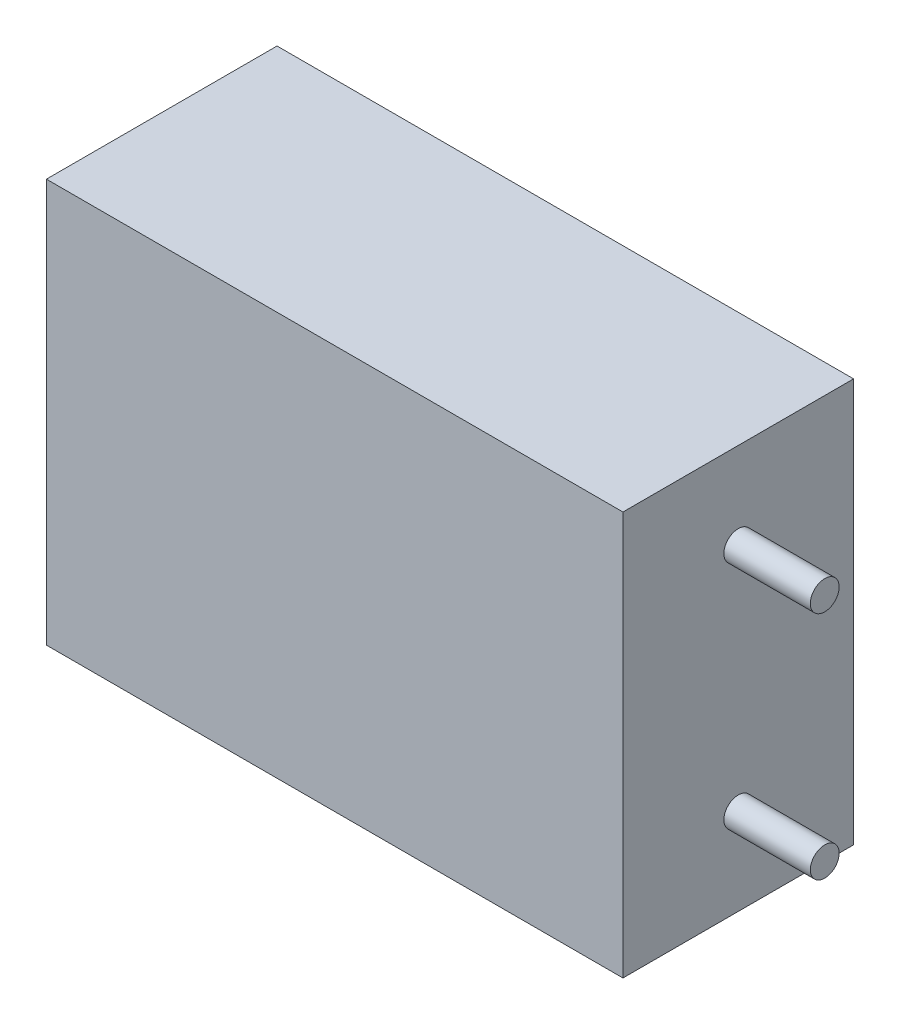
ISO-10303-21;
HEADER;
FILE_DESCRIPTION(('STEP AP214'),'2;1');
FILE_NAME('part.step','',(''),(''),'','','');
FILE_SCHEMA(('AUTOMOTIVE_DESIGN { 1 0 10303 214 1 1 1 1 }'));
ENDSEC;
DATA;
#1=APPLICATION_CONTEXT('core data for automotive mechanical design processes');
#2=APPLICATION_PROTOCOL_DEFINITION('international standard','automotive_design',2000,#1);
#3=PRODUCT_CONTEXT('',#1,'mechanical');
#4=PRODUCT('Part','Part','',(#3));
#5=PRODUCT_RELATED_PRODUCT_CATEGORY('part','',(#4));
#6=PRODUCT_DEFINITION_FORMATION('','',#4);
#7=PRODUCT_DEFINITION_CONTEXT('part definition',#1,'design');
#8=PRODUCT_DEFINITION('design','',#6,#7);
#9=PRODUCT_DEFINITION_SHAPE('','',#8);
#10=(LENGTH_UNIT() NAMED_UNIT(*) SI_UNIT(.MILLI.,.METRE.));
#11=(NAMED_UNIT(*) PLANE_ANGLE_UNIT() SI_UNIT($,.RADIAN.));
#12=(NAMED_UNIT(*) SI_UNIT($,.STERADIAN.) SOLID_ANGLE_UNIT());
#13=UNCERTAINTY_MEASURE_WITH_UNIT(LENGTH_MEASURE(1.E-05),#10,'distance_accuracy_value','');
#14=(GEOMETRIC_REPRESENTATION_CONTEXT(3) GLOBAL_UNCERTAINTY_ASSIGNED_CONTEXT((#13)) GLOBAL_UNIT_ASSIGNED_CONTEXT((#10,
#11,#12)) REPRESENTATION_CONTEXT('',''));
#15=CARTESIAN_POINT('',(0.,0.,0.));
#16=DIRECTION('',(0.,0.,1.));
#17=DIRECTION('',(1.,0.,0.));
#18=AXIS2_PLACEMENT_3D('',#15,#16,#17);
#19=CARTESIAN_POINT('',(-24.8964757709251,44.45,-15.8050660792952));
#20=DIRECTION('',(1.,0.,0.));
#21=DIRECTION('',(0.,0.,-1.));
#22=AXIS2_PLACEMENT_3D('',#19,#20,#21);
#23=PLANE('',#22);
#24=DIRECTION('',(0.,0.,1.));
#25=VECTOR('',#24,1.);
#26=CARTESIAN_POINT('',(-24.8964757709251,0.,-15.8050660792952));
#27=LINE('',#26,#25);
#28=CARTESIAN_POINT('',(-24.8964757709251,0.,-41.2050660792952));
#29=VERTEX_POINT('',#28);
#30=CARTESIAN_POINT('',(-24.8964757709251,0.,-15.8050660792952));
#31=VERTEX_POINT('',#30);
#32=EDGE_CURVE('E100',#29,#31,#27,.T.);
#33=ORIENTED_EDGE('',*,*,#32,.T.);
#34=DIRECTION('',(0.,-1.,0.));
#35=VECTOR('',#34,1.);
#36=CARTESIAN_POINT('',(-24.8964757709251,44.45,-15.8050660792952));
#37=LINE('',#36,#35);
#38=CARTESIAN_POINT('',(-24.8964757709251,44.45,-15.8050660792952));
#39=VERTEX_POINT('',#38);
#40=EDGE_CURVE('E91',#39,#31,#37,.T.);
#41=ORIENTED_EDGE('',*,*,#40,.F.);
#42=DIRECTION('',(0.,0.,1.));
#43=VECTOR('',#42,1.);
#44=CARTESIAN_POINT('',(-24.8964757709251,44.45,-15.8050660792952));
#45=LINE('',#44,#43);
#46=CARTESIAN_POINT('',(-24.8964757709251,44.45,-41.2050660792952));
#47=VERTEX_POINT('',#46);
#48=EDGE_CURVE('E85',#47,#39,#45,.T.);
#49=ORIENTED_EDGE('',*,*,#48,.F.);
#50=DIRECTION('',(0.,-1.,0.));
#51=VECTOR('',#50,1.);
#52=CARTESIAN_POINT('',(-24.8964757709251,44.45,-41.2050660792952));
#53=LINE('',#52,#51);
#54=EDGE_CURVE('E96',#47,#29,#53,.T.);
#55=ORIENTED_EDGE('',*,*,#54,.T.);
#56=EDGE_LOOP('',(#33,#41,#49,#55));
#57=FACE_BOUND('',#56,.T.);
#58=ADVANCED_FACE('F33',(#57),#23,.F.);
#59=CARTESIAN_POINT('',(38.6035242290749,44.45,-15.8050660792952));
#60=DIRECTION('',(0.,0.,-1.));
#61=DIRECTION('',(-1.,0.,0.));
#62=AXIS2_PLACEMENT_3D('',#59,#60,#61);
#63=PLANE('',#62);
#64=DIRECTION('',(1.,0.,0.));
#65=VECTOR('',#64,1.);
#66=CARTESIAN_POINT('',(38.6035242290749,0.,-15.8050660792952));
#67=LINE('',#66,#65);
#68=CARTESIAN_POINT('',(38.6035242290749,0.,-15.8050660792952));
#69=VERTEX_POINT('',#68);
#70=EDGE_CURVE('E90',#31,#69,#67,.T.);
#71=ORIENTED_EDGE('',*,*,#70,.T.);
#72=DIRECTION('',(0.,-1.,0.));
#73=VECTOR('',#72,1.);
#74=CARTESIAN_POINT('',(38.6035242290749,44.45,-15.8050660792952));
#75=LINE('',#74,#73);
#76=CARTESIAN_POINT('',(38.6035242290749,44.45,-15.8050660792952));
#77=VERTEX_POINT('',#76);
#78=EDGE_CURVE('E88',#77,#69,#75,.T.);
#79=ORIENTED_EDGE('',*,*,#78,.F.);
#80=DIRECTION('',(1.,0.,0.));
#81=VECTOR('',#80,1.);
#82=CARTESIAN_POINT('',(38.6035242290749,44.45,-15.8050660792952));
#83=LINE('',#82,#81);
#84=EDGE_CURVE('E80',#39,#77,#83,.T.);
#85=ORIENTED_EDGE('',*,*,#84,.F.);
#86=ORIENTED_EDGE('',*,*,#40,.T.);
#87=EDGE_LOOP('',(#71,#79,#85,#86));
#88=FACE_BOUND('',#87,.T.);
#89=ADVANCED_FACE('F89',(#88),#63,.F.);
#90=CARTESIAN_POINT('',(38.6035242290749,44.45,-41.2050660792952));
#91=DIRECTION('',(-1.,0.,0.));
#92=DIRECTION('',(0.,0.,1.));
#93=AXIS2_PLACEMENT_3D('',#90,#91,#92);
#94=PLANE('',#93);
#95=CARTESIAN_POINT('',(38.6035242290749,9.525,-28.5050660792952));
#96=DIRECTION('',(-1.,0.,0.));
#97=DIRECTION('',(0.,0.,1.));
#98=AXIS2_PLACEMENT_3D('',#95,#96,#97);
#99=CIRCLE('',#98,1.5875);
#100=CARTESIAN_POINT('',(38.6035242290749,9.525,-26.9175660792952));
#101=VERTEX_POINT('',#100);
#102=EDGE_CURVE('E11',#101,#101,#99,.F.);
#103=ORIENTED_EDGE('',*,*,#102,.F.);
#104=EDGE_LOOP('',(#103));
#105=FACE_BOUND('',#104,.T.);
#106=CARTESIAN_POINT('',(38.6035242290749,34.925,-28.5050660792952));
#107=DIRECTION('',(-1.,0.,0.));
#108=DIRECTION('',(0.,0.,1.));
#109=AXIS2_PLACEMENT_3D('',#106,#107,#108);
#110=CIRCLE('',#109,1.5875);
#111=CARTESIAN_POINT('',(38.6035242290749,34.925,-26.9175660792952));
#112=VERTEX_POINT('',#111);
#113=EDGE_CURVE('E41',#112,#112,#110,.F.);
#114=ORIENTED_EDGE('',*,*,#113,.F.);
#115=EDGE_LOOP('',(#114));
#116=FACE_BOUND('',#115,.T.);
#117=DIRECTION('',(0.,0.,-1.));
#118=VECTOR('',#117,1.);
#119=CARTESIAN_POINT('',(38.6035242290749,0.,-41.2050660792952));
#120=LINE('',#119,#118);
#121=CARTESIAN_POINT('',(38.6035242290749,0.,-41.2050660792952));
#122=VERTEX_POINT('',#121);
#123=EDGE_CURVE('E66',#69,#122,#120,.T.);
#124=ORIENTED_EDGE('',*,*,#123,.T.);
#125=DIRECTION('',(0.,-1.,0.));
#126=VECTOR('',#125,1.);
#127=CARTESIAN_POINT('',(38.6035242290749,44.45,-41.2050660792952));
#128=LINE('',#127,#126);
#129=CARTESIAN_POINT('',(38.6035242290749,44.45,-41.2050660792952));
#130=VERTEX_POINT('',#129);
#131=EDGE_CURVE('E92',#130,#122,#128,.T.);
#132=ORIENTED_EDGE('',*,*,#131,.F.);
#133=DIRECTION('',(0.,0.,-1.));
#134=VECTOR('',#133,1.);
#135=CARTESIAN_POINT('',(38.6035242290749,44.45,-41.2050660792952));
#136=LINE('',#135,#134);
#137=EDGE_CURVE('E83',#77,#130,#136,.T.);
#138=ORIENTED_EDGE('',*,*,#137,.F.);
#139=ORIENTED_EDGE('',*,*,#78,.T.);
#140=EDGE_LOOP('',(#124,#132,#138,#139));
#141=FACE_BOUND('',#140,.T.);
#142=ADVANCED_FACE('F94',(#105,#116,#141),#94,.F.);
#143=CARTESIAN_POINT('',(-24.8964757709251,44.45,-41.2050660792952));
#144=DIRECTION('',(0.,0.,1.));
#145=DIRECTION('',(1.,0.,0.));
#146=AXIS2_PLACEMENT_3D('',#143,#144,#145);
#147=PLANE('',#146);
#148=DIRECTION('',(-1.,0.,0.));
#149=VECTOR('',#148,1.);
#150=CARTESIAN_POINT('',(-24.8964757709251,0.,-41.2050660792952));
#151=LINE('',#150,#149);
#152=EDGE_CURVE('E72',#122,#29,#151,.T.);
#153=ORIENTED_EDGE('',*,*,#152,.T.);
#154=ORIENTED_EDGE('',*,*,#54,.F.);
#155=DIRECTION('',(-1.,0.,0.));
#156=VECTOR('',#155,1.);
#157=CARTESIAN_POINT('',(-24.8964757709251,44.45,-41.2050660792952));
#158=LINE('',#157,#156);
#159=EDGE_CURVE('E49',#130,#47,#158,.T.);
#160=ORIENTED_EDGE('',*,*,#159,.F.);
#161=ORIENTED_EDGE('',*,*,#131,.T.);
#162=EDGE_LOOP('',(#153,#154,#160,#161));
#163=FACE_BOUND('',#162,.T.);
#164=ADVANCED_FACE('F115',(#163),#147,.F.);
#165=CARTESIAN_POINT('',(0.,44.45,0.));
#166=DIRECTION('',(0.,-1.,0.));
#167=DIRECTION('',(0.,0.,-1.));
#168=AXIS2_PLACEMENT_3D('',#165,#166,#167);
#169=PLANE('',#168);
#170=ORIENTED_EDGE('',*,*,#48,.T.);
#171=ORIENTED_EDGE('',*,*,#84,.T.);
#172=ORIENTED_EDGE('',*,*,#137,.T.);
#173=ORIENTED_EDGE('',*,*,#159,.T.);
#174=EDGE_LOOP('',(#170,#171,#172,#173));
#175=FACE_BOUND('',#174,.T.);
#176=ADVANCED_FACE('F81',(#175),#169,.F.);
#177=CARTESIAN_POINT('',(0.,0.,0.));
#178=DIRECTION('',(0.,-1.,0.));
#179=DIRECTION('',(0.,0.,-1.));
#180=AXIS2_PLACEMENT_3D('',#177,#178,#179);
#181=PLANE('',#180);
#182=ORIENTED_EDGE('',*,*,#32,.F.);
#183=ORIENTED_EDGE('',*,*,#152,.F.);
#184=ORIENTED_EDGE('',*,*,#123,.F.);
#185=ORIENTED_EDGE('',*,*,#70,.F.);
#186=EDGE_LOOP('',(#182,#183,#184,#185));
#187=FACE_BOUND('',#186,.T.);
#188=ADVANCED_FACE('F130',(#187),#181,.T.);
#189=CARTESIAN_POINT('',(48.1285242290749,34.925,-28.5050660792952));
#190=DIRECTION('',(-1.,0.,0.));
#191=DIRECTION('',(0.,0.,1.));
#192=AXIS2_PLACEMENT_3D('',#189,#190,#191);
#193=CYLINDRICAL_SURFACE('',#192,1.5875);
#194=CARTESIAN_POINT('',(48.1285242290749,34.925,-28.5050660792952));
#195=DIRECTION('',(1.,0.,0.));
#196=DIRECTION('',(0.,0.,-1.));
#197=AXIS2_PLACEMENT_3D('',#194,#195,#196);
#198=CIRCLE('',#197,1.5875);
#199=CARTESIAN_POINT('',(48.1285242290749,34.925,-26.9175660792952));
#200=VERTEX_POINT('',#199);
#201=EDGE_CURVE('E103',#200,#200,#198,.T.);
#202=CARTESIAN_POINT('',(48.1285242290749,34.925,-26.9175660792952));
#203=CARTESIAN_POINT('',(48.0293054790749,34.925,-26.9175660792952));
#204=CARTESIAN_POINT('',(47.9300867290749,34.925,-26.9175660792952));
#205=CARTESIAN_POINT('',(47.7316492290749,34.925,-26.9175660792952));
#206=CARTESIAN_POINT('',(47.6324304790749,34.925,-26.9175660792952));
#207=CARTESIAN_POINT('',(47.4339929790749,34.925,-26.9175660792952));
#208=CARTESIAN_POINT('',(47.3347742290749,34.925,-26.9175660792952));
#209=CARTESIAN_POINT('',(47.1363367290749,34.925,-26.9175660792952));
#210=CARTESIAN_POINT('',(47.0371179790749,34.925,-26.9175660792952));
#211=CARTESIAN_POINT('',(46.8386804790749,34.925,-26.9175660792952));
#212=CARTESIAN_POINT('',(46.7394617290749,34.925,-26.9175660792952));
#213=CARTESIAN_POINT('',(46.5410242290749,34.925,-26.9175660792952));
#214=CARTESIAN_POINT('',(46.4418054790749,34.925,-26.9175660792952));
#215=CARTESIAN_POINT('',(46.2433679790749,34.925,-26.9175660792952));
#216=CARTESIAN_POINT('',(46.1441492290749,34.925,-26.9175660792952));
#217=CARTESIAN_POINT('',(45.9457117290749,34.925,-26.9175660792952));
#218=CARTESIAN_POINT('',(45.8464929790749,34.925,-26.9175660792952));
#219=CARTESIAN_POINT('',(45.6480554790749,34.925,-26.9175660792952));
#220=CARTESIAN_POINT('',(45.5488367290749,34.925,-26.9175660792952));
#221=CARTESIAN_POINT('',(45.3503992290749,34.925,-26.9175660792952));
#222=CARTESIAN_POINT('',(45.2511804790749,34.925,-26.9175660792952));
#223=CARTESIAN_POINT('',(45.0527429790749,34.925,-26.9175660792952));
#224=CARTESIAN_POINT('',(44.9535242290749,34.925,-26.9175660792952));
#225=CARTESIAN_POINT('',(44.7550867290749,34.925,-26.9175660792952));
#226=CARTESIAN_POINT('',(44.6558679790749,34.925,-26.9175660792952));
#227=CARTESIAN_POINT('',(44.4574304790749,34.925,-26.9175660792952));
#228=CARTESIAN_POINT('',(44.3582117290749,34.925,-26.9175660792952));
#229=CARTESIAN_POINT('',(44.1597742290749,34.925,-26.9175660792952));
#230=CARTESIAN_POINT('',(44.0605554790749,34.925,-26.9175660792952));
#231=CARTESIAN_POINT('',(43.8621179790749,34.925,-26.9175660792952));
#232=CARTESIAN_POINT('',(43.7628992290749,34.925,-26.9175660792952));
#233=CARTESIAN_POINT('',(43.5644617290749,34.925,-26.9175660792952));
#234=CARTESIAN_POINT('',(43.4652429790749,34.925,-26.9175660792952));
#235=CARTESIAN_POINT('',(43.2668054790749,34.925,-26.9175660792952));
#236=CARTESIAN_POINT('',(43.1675867290749,34.925,-26.9175660792952));
#237=CARTESIAN_POINT('',(42.9691492290749,34.925,-26.9175660792952));
#238=CARTESIAN_POINT('',(42.8699304790749,34.925,-26.9175660792952));
#239=CARTESIAN_POINT('',(42.6714929790749,34.925,-26.9175660792952));
#240=CARTESIAN_POINT('',(42.5722742290749,34.925,-26.9175660792952));
#241=CARTESIAN_POINT('',(42.3738367290749,34.925,-26.9175660792952));
#242=CARTESIAN_POINT('',(42.2746179790749,34.925,-26.9175660792952));
#243=CARTESIAN_POINT('',(42.0761804790749,34.925,-26.9175660792952));
#244=CARTESIAN_POINT('',(41.9769617290749,34.925,-26.9175660792952));
#245=CARTESIAN_POINT('',(41.7785242290749,34.925,-26.9175660792952));
#246=CARTESIAN_POINT('',(41.6793054790749,34.925,-26.9175660792952));
#247=CARTESIAN_POINT('',(41.4808679790749,34.925,-26.9175660792952));
#248=CARTESIAN_POINT('',(41.3816492290749,34.925,-26.9175660792952));
#249=CARTESIAN_POINT('',(41.1832117290749,34.925,-26.9175660792952));
#250=CARTESIAN_POINT('',(41.0839929790749,34.925,-26.9175660792952));
#251=CARTESIAN_POINT('',(40.8855554790749,34.925,-26.9175660792952));
#252=CARTESIAN_POINT('',(40.7863367290749,34.925,-26.9175660792952));
#253=CARTESIAN_POINT('',(40.5878992290749,34.925,-26.9175660792952));
#254=CARTESIAN_POINT('',(40.4886804790749,34.925,-26.9175660792952));
#255=CARTESIAN_POINT('',(40.2902429790749,34.925,-26.9175660792952));
#256=CARTESIAN_POINT('',(40.1910242290749,34.925,-26.9175660792952));
#257=CARTESIAN_POINT('',(39.9925867290749,34.925,-26.9175660792952));
#258=CARTESIAN_POINT('',(39.8933679790749,34.925,-26.9175660792952));
#259=CARTESIAN_POINT('',(39.6949304790749,34.925,-26.9175660792952));
#260=CARTESIAN_POINT('',(39.5957117290749,34.925,-26.9175660792952));
#261=CARTESIAN_POINT('',(39.3972742290749,34.925,-26.9175660792952));
#262=CARTESIAN_POINT('',(39.2980554790749,34.925,-26.9175660792952));
#263=CARTESIAN_POINT('',(39.0996179790749,34.925,-26.9175660792952));
#264=CARTESIAN_POINT('',(39.0003992290749,34.925,-26.9175660792952));
#265=CARTESIAN_POINT('',(38.8019617290749,34.925,-26.9175660792952));
#266=CARTESIAN_POINT('',(38.7027429790749,34.925,-26.9175660792952));
#267=CARTESIAN_POINT('',(38.6035242290749,34.925,-26.9175660792952));
#268=B_SPLINE_CURVE_WITH_KNOTS('',3,(#202,#203,#204,#205,#206,#207,#208,#209,#210,#211,#212,
#213,#214,#215,#216,#217,#218,#219,#220,#221,#222,#223,#224,#225,#226,#227,#228,#229,#230,#231,
#232,#233,#234,#235,#236,#237,#238,#239,#240,#241,#242,#243,#244,#245,#246,#247,#248,#249,#250,
#251,#252,#253,#254,#255,#256,#257,#258,#259,#260,#261,#262,#263,#264,#265,#266,#267),
.UNSPECIFIED.,.F.,.F.,(4,2,2,2,2,2,2,2,2,2,2,2,2,2,2,2,2,2,2,2,2,2,2,2,2,2,2,2,2,2,2,2,4),(0.,
0.29765625,0.5953125,0.892968750000001,1.190625,1.48828125,1.7859375,2.08359375,2.38125,
2.67890625,2.9765625,3.27421875,3.571875,3.86953125,4.1671875,4.46484375,4.7625,5.06015625,
5.3578125,5.65546875,5.953125,6.25078125,6.5484375,6.84609375,7.14375,7.44140625,7.7390625,
8.03671875,8.334375,8.63203125,8.9296875,9.22734375,9.525),.UNSPECIFIED.);
#269=EDGE_CURVE('BSEAM112',#200,#112,#268,.T.);
#270=ORIENTED_EDGE('',*,*,#201,.F.);
#271=ORIENTED_EDGE('',*,*,#113,.T.);
#272=ORIENTED_EDGE('',*,*,#269,.T.);
#273=ORIENTED_EDGE('',*,*,#269,.F.);
#274=EDGE_LOOP('',(#270,#272,#271,#273));
#275=FACE_BOUND('',#274,.T.);
#276=ADVANCED_FACE('F112',(#275),#193,.T.);
#277=CARTESIAN_POINT('',(48.1285242290749,34.925,-28.5050660792952));
#278=DIRECTION('',(1.,0.,0.));
#279=DIRECTION('',(0.,0.,-1.));
#280=AXIS2_PLACEMENT_3D('',#277,#278,#279);
#281=PLANE('',#280);
#282=ORIENTED_EDGE('',*,*,#201,.T.);
#283=EDGE_LOOP('',(#282));
#284=FACE_BOUND('',#283,.T.);
#285=ADVANCED_FACE('F137',(#284),#281,.T.);
#286=CARTESIAN_POINT('',(48.1285242290749,9.525,-28.5050660792952));
#287=DIRECTION('',(-1.,0.,0.));
#288=DIRECTION('',(0.,0.,1.));
#289=AXIS2_PLACEMENT_3D('',#286,#287,#288);
#290=CYLINDRICAL_SURFACE('',#289,1.5875);
#291=CARTESIAN_POINT('',(48.1285242290749,9.525,-28.5050660792952));
#292=DIRECTION('',(1.,0.,0.));
#293=DIRECTION('',(0.,0.,-1.));
#294=AXIS2_PLACEMENT_3D('',#291,#292,#293);
#295=CIRCLE('',#294,1.5875);
#296=CARTESIAN_POINT('',(48.1285242290749,9.525,-26.9175660792952));
#297=VERTEX_POINT('',#296);
#298=EDGE_CURVE('E156',#297,#297,#295,.T.);
#299=CARTESIAN_POINT('',(48.1285242290749,9.525,-26.9175660792952));
#300=CARTESIAN_POINT('',(48.0293054790749,9.525,-26.9175660792952));
#301=CARTESIAN_POINT('',(47.9300867290749,9.525,-26.9175660792952));
#302=CARTESIAN_POINT('',(47.7316492290749,9.525,-26.9175660792952));
#303=CARTESIAN_POINT('',(47.6324304790749,9.525,-26.9175660792952));
#304=CARTESIAN_POINT('',(47.4339929790749,9.525,-26.9175660792952));
#305=CARTESIAN_POINT('',(47.3347742290749,9.525,-26.9175660792952));
#306=CARTESIAN_POINT('',(47.1363367290749,9.525,-26.9175660792952));
#307=CARTESIAN_POINT('',(47.0371179790749,9.525,-26.9175660792952));
#308=CARTESIAN_POINT('',(46.8386804790749,9.525,-26.9175660792952));
#309=CARTESIAN_POINT('',(46.7394617290749,9.525,-26.9175660792952));
#310=CARTESIAN_POINT('',(46.5410242290749,9.525,-26.9175660792952));
#311=CARTESIAN_POINT('',(46.4418054790749,9.525,-26.9175660792952));
#312=CARTESIAN_POINT('',(46.2433679790749,9.525,-26.9175660792952));
#313=CARTESIAN_POINT('',(46.1441492290749,9.525,-26.9175660792952));
#314=CARTESIAN_POINT('',(45.9457117290749,9.525,-26.9175660792952));
#315=CARTESIAN_POINT('',(45.8464929790749,9.525,-26.9175660792952));
#316=CARTESIAN_POINT('',(45.6480554790749,9.525,-26.9175660792952));
#317=CARTESIAN_POINT('',(45.5488367290749,9.525,-26.9175660792952));
#318=CARTESIAN_POINT('',(45.3503992290749,9.525,-26.9175660792952));
#319=CARTESIAN_POINT('',(45.2511804790749,9.525,-26.9175660792952));
#320=CARTESIAN_POINT('',(45.0527429790749,9.525,-26.9175660792952));
#321=CARTESIAN_POINT('',(44.9535242290749,9.525,-26.9175660792952));
#322=CARTESIAN_POINT('',(44.7550867290749,9.525,-26.9175660792952));
#323=CARTESIAN_POINT('',(44.6558679790749,9.525,-26.9175660792952));
#324=CARTESIAN_POINT('',(44.4574304790749,9.525,-26.9175660792952));
#325=CARTESIAN_POINT('',(44.3582117290749,9.525,-26.9175660792952));
#326=CARTESIAN_POINT('',(44.1597742290749,9.525,-26.9175660792952));
#327=CARTESIAN_POINT('',(44.0605554790749,9.525,-26.9175660792952));
#328=CARTESIAN_POINT('',(43.8621179790749,9.525,-26.9175660792952));
#329=CARTESIAN_POINT('',(43.7628992290749,9.525,-26.9175660792952));
#330=CARTESIAN_POINT('',(43.5644617290749,9.525,-26.9175660792952));
#331=CARTESIAN_POINT('',(43.4652429790749,9.525,-26.9175660792952));
#332=CARTESIAN_POINT('',(43.2668054790749,9.525,-26.9175660792952));
#333=CARTESIAN_POINT('',(43.1675867290749,9.525,-26.9175660792952));
#334=CARTESIAN_POINT('',(42.9691492290749,9.525,-26.9175660792952));
#335=CARTESIAN_POINT('',(42.8699304790749,9.525,-26.9175660792952));
#336=CARTESIAN_POINT('',(42.6714929790749,9.525,-26.9175660792952));
#337=CARTESIAN_POINT('',(42.5722742290749,9.525,-26.9175660792952));
#338=CARTESIAN_POINT('',(42.3738367290749,9.525,-26.9175660792952));
#339=CARTESIAN_POINT('',(42.2746179790749,9.525,-26.9175660792952));
#340=CARTESIAN_POINT('',(42.0761804790749,9.525,-26.9175660792952));
#341=CARTESIAN_POINT('',(41.9769617290749,9.525,-26.9175660792952));
#342=CARTESIAN_POINT('',(41.7785242290749,9.525,-26.9175660792952));
#343=CARTESIAN_POINT('',(41.6793054790749,9.525,-26.9175660792952));
#344=CARTESIAN_POINT('',(41.4808679790749,9.525,-26.9175660792952));
#345=CARTESIAN_POINT('',(41.3816492290749,9.525,-26.9175660792952));
#346=CARTESIAN_POINT('',(41.1832117290749,9.525,-26.9175660792952));
#347=CARTESIAN_POINT('',(41.0839929790749,9.525,-26.9175660792952));
#348=CARTESIAN_POINT('',(40.8855554790749,9.525,-26.9175660792952));
#349=CARTESIAN_POINT('',(40.7863367290749,9.525,-26.9175660792952));
#350=CARTESIAN_POINT('',(40.5878992290749,9.525,-26.9175660792952));
#351=CARTESIAN_POINT('',(40.4886804790749,9.525,-26.9175660792952));
#352=CARTESIAN_POINT('',(40.2902429790749,9.525,-26.9175660792952));
#353=CARTESIAN_POINT('',(40.1910242290749,9.525,-26.9175660792952));
#354=CARTESIAN_POINT('',(39.9925867290749,9.525,-26.9175660792952));
#355=CARTESIAN_POINT('',(39.8933679790749,9.525,-26.9175660792952));
#356=CARTESIAN_POINT('',(39.6949304790749,9.525,-26.9175660792952));
#357=CARTESIAN_POINT('',(39.5957117290749,9.525,-26.9175660792952));
#358=CARTESIAN_POINT('',(39.3972742290749,9.525,-26.9175660792952));
#359=CARTESIAN_POINT('',(39.2980554790749,9.525,-26.9175660792952));
#360=CARTESIAN_POINT('',(39.0996179790749,9.525,-26.9175660792952));
#361=CARTESIAN_POINT('',(39.0003992290749,9.525,-26.9175660792952));
#362=CARTESIAN_POINT('',(38.8019617290749,9.525,-26.9175660792952));
#363=CARTESIAN_POINT('',(38.7027429790749,9.525,-26.9175660792952));
#364=CARTESIAN_POINT('',(38.6035242290749,9.525,-26.9175660792952));
#365=B_SPLINE_CURVE_WITH_KNOTS('',3,(#299,#300,#301,#302,#303,#304,#305,#306,#307,#308,#309,
#310,#311,#312,#313,#314,#315,#316,#317,#318,#319,#320,#321,#322,#323,#324,#325,#326,#327,#328,
#329,#330,#331,#332,#333,#334,#335,#336,#337,#338,#339,#340,#341,#342,#343,#344,#345,#346,#347,
#348,#349,#350,#351,#352,#353,#354,#355,#356,#357,#358,#359,#360,#361,#362,#363,#364),
.UNSPECIFIED.,.F.,.F.,(4,2,2,2,2,2,2,2,2,2,2,2,2,2,2,2,2,2,2,2,2,2,2,2,2,2,2,2,2,2,2,2,4),(0.,
0.29765625,0.5953125,0.892968750000001,1.190625,1.48828125,1.7859375,2.08359375,2.38125,
2.67890625,2.9765625,3.27421875,3.571875,3.86953125,4.1671875,4.46484375,4.7625,5.06015625,
5.3578125,5.65546875,5.953125,6.25078125,6.5484375,6.84609375,7.14375,7.44140625,7.7390625,
8.03671875,8.334375,8.63203125,8.9296875,9.22734375,9.525),.UNSPECIFIED.);
#366=EDGE_CURVE('BSEAM144',#297,#101,#365,.T.);
#367=ORIENTED_EDGE('',*,*,#298,.F.);
#368=ORIENTED_EDGE('',*,*,#102,.T.);
#369=ORIENTED_EDGE('',*,*,#366,.T.);
#370=ORIENTED_EDGE('',*,*,#366,.F.);
#371=EDGE_LOOP('',(#367,#369,#368,#370));
#372=FACE_BOUND('',#371,.T.);
#373=ADVANCED_FACE('F144',(#372),#290,.T.);
#374=CARTESIAN_POINT('',(48.1285242290749,9.525,-28.5050660792952));
#375=DIRECTION('',(1.,0.,0.));
#376=DIRECTION('',(0.,0.,-1.));
#377=AXIS2_PLACEMENT_3D('',#374,#375,#376);
#378=PLANE('',#377);
#379=ORIENTED_EDGE('',*,*,#298,.T.);
#380=EDGE_LOOP('',(#379));
#381=FACE_BOUND('',#380,.T.);
#382=ADVANCED_FACE('F148',(#381),#378,.T.);
#383=CLOSED_SHELL('',(#58,#89,#142,#164,#176,#188,#276,#285,#373,#382));
#384=MANIFOLD_SOLID_BREP('B2',#383);
#385=ADVANCED_BREP_SHAPE_REPRESENTATION('',(#18,#384),#14);
#386=SHAPE_DEFINITION_REPRESENTATION(#9,#385);
ENDSEC;
END-ISO-10303-21;
